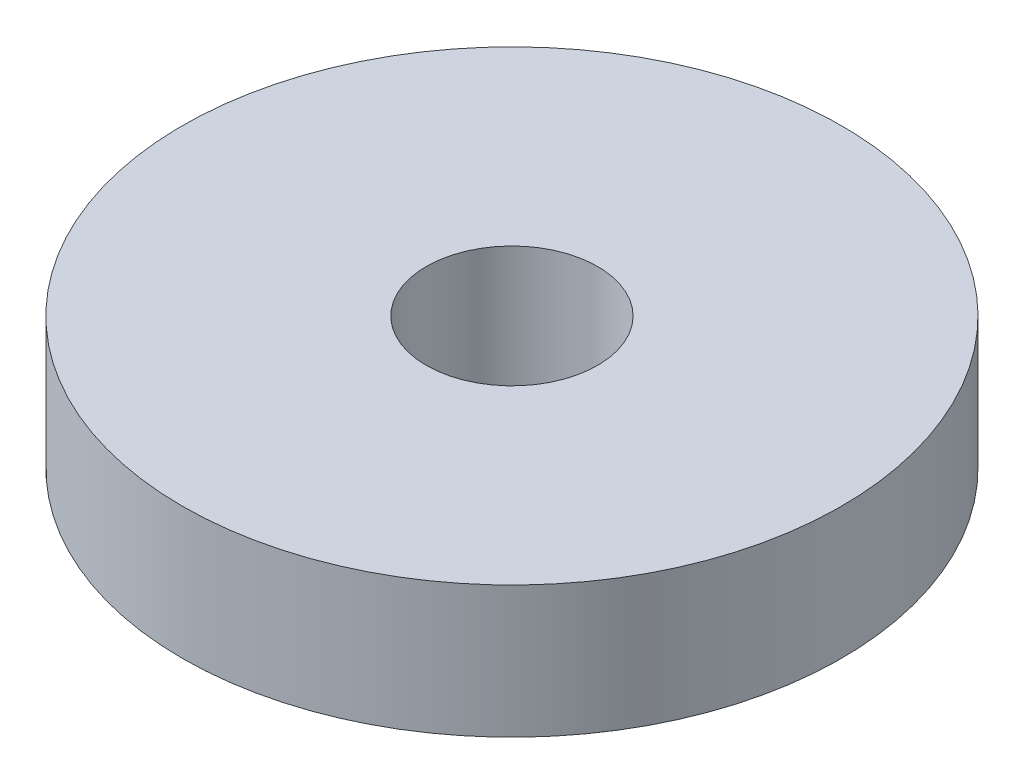
ISO-10303-21;
HEADER;
FILE_DESCRIPTION(('STEP AP214'),'2;1');
FILE_NAME('part.step','',(''),(''),'','','');
FILE_SCHEMA(('AUTOMOTIVE_DESIGN { 1 0 10303 214 1 1 1 1 }'));
ENDSEC;
DATA;
#1=APPLICATION_CONTEXT('core data for automotive mechanical design processes');
#2=APPLICATION_PROTOCOL_DEFINITION('international standard','automotive_design',2000,#1);
#3=PRODUCT_CONTEXT('',#1,'mechanical');
#4=PRODUCT('Part','Part','',(#3));
#5=PRODUCT_RELATED_PRODUCT_CATEGORY('part','',(#4));
#6=PRODUCT_DEFINITION_FORMATION('','',#4);
#7=PRODUCT_DEFINITION_CONTEXT('part definition',#1,'design');
#8=PRODUCT_DEFINITION('design','',#6,#7);
#9=PRODUCT_DEFINITION_SHAPE('','',#8);
#10=(LENGTH_UNIT() NAMED_UNIT(*) SI_UNIT(.MILLI.,.METRE.));
#11=(NAMED_UNIT(*) PLANE_ANGLE_UNIT() SI_UNIT($,.RADIAN.));
#12=(NAMED_UNIT(*) SI_UNIT($,.STERADIAN.) SOLID_ANGLE_UNIT());
#13=UNCERTAINTY_MEASURE_WITH_UNIT(LENGTH_MEASURE(1.E-05),#10,'distance_accuracy_value','');
#14=(GEOMETRIC_REPRESENTATION_CONTEXT(3) GLOBAL_UNCERTAINTY_ASSIGNED_CONTEXT((#13)) GLOBAL_UNIT_ASSIGNED_CONTEXT((#10,
#11,#12)) REPRESENTATION_CONTEXT('',''));
#15=CARTESIAN_POINT('',(0.,0.,0.));
#16=DIRECTION('',(0.,0.,1.));
#17=DIRECTION('',(1.,0.,0.));
#18=AXIS2_PLACEMENT_3D('',#15,#16,#17);
#19=CARTESIAN_POINT('',(0.,2.54,0.));
#20=DIRECTION('',(0.,1.,0.));
#21=DIRECTION('',(0.,0.,1.));
#22=AXIS2_PLACEMENT_3D('',#19,#20,#21);
#23=PLANE('',#22);
#24=CARTESIAN_POINT('',(0.,2.54,0.));
#25=DIRECTION('',(0.,1.,0.));
#26=DIRECTION('',(0.,0.,1.));
#27=AXIS2_PLACEMENT_3D('',#24,#25,#26);
#28=CIRCLE('',#27,6.35);
#29=CARTESIAN_POINT('',(0.,2.54,6.35));
#30=VERTEX_POINT('',#29);
#31=EDGE_CURVE('E10',#30,#30,#28,.T.);
#32=ORIENTED_EDGE('',*,*,#31,.T.);
#33=EDGE_LOOP('',(#32));
#34=FACE_BOUND('',#33,.T.);
#35=CARTESIAN_POINT('',(0.,2.54,0.));
#36=DIRECTION('',(0.,1.,0.));
#37=DIRECTION('',(0.,0.,1.));
#38=AXIS2_PLACEMENT_3D('',#35,#36,#37);
#39=CIRCLE('',#38,1.651);
#40=CARTESIAN_POINT('',(0.,2.54,1.651));
#41=VERTEX_POINT('',#40);
#42=EDGE_CURVE('E49',#41,#41,#39,.T.);
#43=ORIENTED_EDGE('',*,*,#42,.F.);
#44=EDGE_LOOP('',(#43));
#45=FACE_BOUND('',#44,.T.);
#46=ADVANCED_FACE('F38',(#34,#45),#23,.T.);
#47=CARTESIAN_POINT('',(0.,0.,0.));
#48=DIRECTION('',(0.,1.,0.));
#49=DIRECTION('',(0.,0.,1.));
#50=AXIS2_PLACEMENT_3D('',#47,#48,#49);
#51=PLANE('',#50);
#52=CARTESIAN_POINT('',(0.,0.,0.));
#53=DIRECTION('',(0.,1.,0.));
#54=DIRECTION('',(0.,0.,1.));
#55=AXIS2_PLACEMENT_3D('',#52,#53,#54);
#56=CIRCLE('',#55,6.35);
#57=CARTESIAN_POINT('',(0.,0.,6.35));
#58=VERTEX_POINT('',#57);
#59=EDGE_CURVE('E42',#58,#58,#56,.T.);
#60=ORIENTED_EDGE('',*,*,#59,.F.);
#61=EDGE_LOOP('',(#60));
#62=FACE_BOUND('',#61,.T.);
#63=CARTESIAN_POINT('',(0.,0.,0.));
#64=DIRECTION('',(0.,1.,0.));
#65=DIRECTION('',(0.,0.,1.));
#66=AXIS2_PLACEMENT_3D('',#63,#64,#65);
#67=CIRCLE('',#66,1.651);
#68=CARTESIAN_POINT('',(0.,0.,1.651));
#69=VERTEX_POINT('',#68);
#70=EDGE_CURVE('E51',#69,#69,#67,.T.);
#71=ORIENTED_EDGE('',*,*,#70,.T.);
#72=EDGE_LOOP('',(#71));
#73=FACE_BOUND('',#72,.T.);
#74=ADVANCED_FACE('F61',(#62,#73),#51,.F.);
#75=CARTESIAN_POINT('',(0.,2.54,0.));
#76=DIRECTION('',(0.,-1.,0.));
#77=DIRECTION('',(0.,0.,-1.));
#78=AXIS2_PLACEMENT_3D('',#75,#76,#77);
#79=CYLINDRICAL_SURFACE('',#78,6.35);
#80=ORIENTED_EDGE('',*,*,#31,.F.);
#81=EDGE_LOOP('',(#80));
#82=FACE_BOUND('',#81,.T.);
#83=ORIENTED_EDGE('',*,*,#59,.T.);
#84=EDGE_LOOP('',(#83));
#85=FACE_BOUND('',#84,.T.);
#86=ADVANCED_FACE('F40',(#82,#85),#79,.T.);
#87=CARTESIAN_POINT('',(0.,2.54,0.));
#88=DIRECTION('',(0.,-1.,0.));
#89=DIRECTION('',(0.,0.,-1.));
#90=AXIS2_PLACEMENT_3D('',#87,#88,#89);
#91=CYLINDRICAL_SURFACE('',#90,1.651);
#92=ORIENTED_EDGE('',*,*,#42,.T.);
#93=EDGE_LOOP('',(#92));
#94=FACE_BOUND('',#93,.T.);
#95=ORIENTED_EDGE('',*,*,#70,.F.);
#96=EDGE_LOOP('',(#95));
#97=FACE_BOUND('',#96,.T.);
#98=ADVANCED_FACE('F57',(#94,#97),#91,.F.);
#99=CLOSED_SHELL('',(#46,#74,#86,#98));
#100=MANIFOLD_SOLID_BREP('B2',#99);
#101=ADVANCED_BREP_SHAPE_REPRESENTATION('',(#18,#100),#14);
#102=SHAPE_DEFINITION_REPRESENTATION(#9,#101);
ENDSEC;
END-ISO-10303-21;
